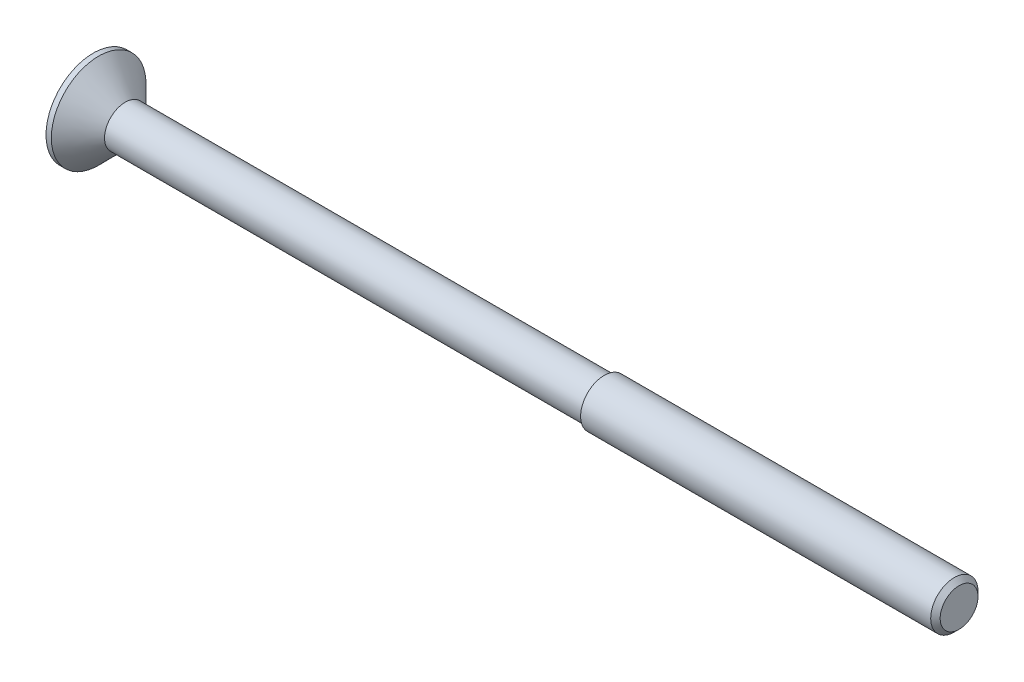
ISO-10303-21;
HEADER;
FILE_DESCRIPTION(('STEP AP214'),'2;1');
FILE_NAME('part.step','',(''),(''),'','','');
FILE_SCHEMA(('AUTOMOTIVE_DESIGN { 1 0 10303 214 1 1 1 1 }'));
ENDSEC;
DATA;
#1=APPLICATION_CONTEXT('core data for automotive mechanical design processes');
#2=APPLICATION_PROTOCOL_DEFINITION('international standard','automotive_design',2000,#1);
#3=PRODUCT_CONTEXT('',#1,'mechanical');
#4=PRODUCT('Part','Part','',(#3));
#5=PRODUCT_RELATED_PRODUCT_CATEGORY('part','',(#4));
#6=PRODUCT_DEFINITION_FORMATION('','',#4);
#7=PRODUCT_DEFINITION_CONTEXT('part definition',#1,'design');
#8=PRODUCT_DEFINITION('design','',#6,#7);
#9=PRODUCT_DEFINITION_SHAPE('','',#8);
#10=(LENGTH_UNIT() NAMED_UNIT(*) SI_UNIT(.MILLI.,.METRE.));
#11=(NAMED_UNIT(*) PLANE_ANGLE_UNIT() SI_UNIT($,.RADIAN.));
#12=(NAMED_UNIT(*) SI_UNIT($,.STERADIAN.) SOLID_ANGLE_UNIT());
#13=UNCERTAINTY_MEASURE_WITH_UNIT(LENGTH_MEASURE(1.E-05),#10,'distance_accuracy_value','');
#14=(GEOMETRIC_REPRESENTATION_CONTEXT(3) GLOBAL_UNCERTAINTY_ASSIGNED_CONTEXT((#13)) GLOBAL_UNIT_ASSIGNED_CONTEXT((#10,
#11,#12)) REPRESENTATION_CONTEXT('',''));
#15=CARTESIAN_POINT('',(0.,0.,0.));
#16=DIRECTION('',(0.,0.,1.));
#17=DIRECTION('',(1.,0.,0.));
#18=AXIS2_PLACEMENT_3D('',#15,#16,#17);
#19=CARTESIAN_POINT('',(0.,0.,0.));
#20=DIRECTION('',(1.,0.,0.));
#21=DIRECTION('',(0.,0.,-1.));
#22=AXIS2_PLACEMENT_3D('',#19,#20,#21);
#23=PLANE('',#22);
#24=CARTESIAN_POINT('',(0.,0.,0.));
#25=DIRECTION('',(-1.,0.,0.));
#26=DIRECTION('',(0.,0.,1.));
#27=AXIS2_PLACEMENT_3D('',#24,#25,#26);
#28=CIRCLE('',#27,4.);
#29=CARTESIAN_POINT('',(0.,0.,4.));
#30=VERTEX_POINT('',#29);
#31=EDGE_CURVE('E106',#30,#30,#28,.T.);
#32=ORIENTED_EDGE('',*,*,#31,.T.);
#33=EDGE_LOOP('',(#32));
#34=FACE_BOUND('',#33,.T.);
#35=DIRECTION('',(0.,0.,1.));
#36=VECTOR('',#35,1.);
#37=CARTESIAN_POINT('',(0.,0.7,0.));
#38=LINE('',#37,#36);
#39=CARTESIAN_POINT('',(0.,0.699999999999991,-2.5));
#40=VERTEX_POINT('',#39);
#41=CARTESIAN_POINT('',(0.,0.699999999999996,-1.0356157588604));
#42=VERTEX_POINT('',#41);
#43=EDGE_CURVE('E245',#40,#42,#38,.T.);
#44=ORIENTED_EDGE('',*,*,#43,.T.);
#45=CARTESIAN_POINT('',(0.,0.,0.));
#46=DIRECTION('',(-1.,0.,0.));
#47=DIRECTION('',(0.,0.,1.));
#48=AXIS2_PLACEMENT_3D('',#45,#46,#47);
#49=CIRCLE('',#48,1.25);
#50=CARTESIAN_POINT('',(0.,1.0356157588604,-0.7));
#51=VERTEX_POINT('',#50);
#52=EDGE_CURVE('E225',#51,#42,#49,.T.);
#53=ORIENTED_EDGE('',*,*,#52,.F.);
#54=DIRECTION('',(0.,-1.,0.));
#55=VECTOR('',#54,1.);
#56=CARTESIAN_POINT('',(0.,0.,-0.7));
#57=LINE('',#56,#55);
#58=CARTESIAN_POINT('',(0.,2.5,-0.7));
#59=VERTEX_POINT('',#58);
#60=EDGE_CURVE('E93',#59,#51,#57,.T.);
#61=ORIENTED_EDGE('',*,*,#60,.F.);
#62=DIRECTION('',(0.,0.,1.));
#63=VECTOR('',#62,1.);
#64=CARTESIAN_POINT('',(0.,2.5,-0.7));
#65=LINE('',#64,#63);
#66=CARTESIAN_POINT('',(0.,2.5,0.7));
#67=VERTEX_POINT('',#66);
#68=EDGE_CURVE('E57',#59,#67,#65,.T.);
#69=ORIENTED_EDGE('',*,*,#68,.T.);
#70=DIRECTION('',(0.,-1.,0.));
#71=VECTOR('',#70,1.);
#72=CARTESIAN_POINT('',(0.,0.,0.7));
#73=LINE('',#72,#71);
#74=CARTESIAN_POINT('',(0.,1.0356157588604,0.7));
#75=VERTEX_POINT('',#74);
#76=EDGE_CURVE('E76',#67,#75,#73,.T.);
#77=ORIENTED_EDGE('',*,*,#76,.T.);
#78=CARTESIAN_POINT('',(0.,0.700000000000004,1.0356157588604));
#79=VERTEX_POINT('',#78);
#80=EDGE_CURVE('E237',#79,#75,#49,.T.);
#81=ORIENTED_EDGE('',*,*,#80,.F.);
#82=CARTESIAN_POINT('',(0.,0.700000000000026,2.49999999999999));
#83=VERTEX_POINT('',#82);
#84=EDGE_CURVE('E256',#79,#83,#38,.T.);
#85=ORIENTED_EDGE('',*,*,#84,.T.);
#86=DIRECTION('',(0.,-1.,0.));
#87=VECTOR('',#86,1.);
#88=CARTESIAN_POINT('',(0.,0.700000000000026,2.49999999999999));
#89=LINE('',#88,#87);
#90=CARTESIAN_POINT('',(0.,-0.699999999999974,2.50000000000001));
#91=VERTEX_POINT('',#90);
#92=EDGE_CURVE('E334',#83,#91,#89,.T.);
#93=ORIENTED_EDGE('',*,*,#92,.T.);
#94=DIRECTION('',(0.,0.,-1.));
#95=VECTOR('',#94,1.);
#96=CARTESIAN_POINT('',(0.,-0.7,0.));
#97=LINE('',#96,#95);
#98=CARTESIAN_POINT('',(0.,-0.699999999999989,1.03561575886041));
#99=VERTEX_POINT('',#98);
#100=EDGE_CURVE('E347',#91,#99,#97,.T.);
#101=ORIENTED_EDGE('',*,*,#100,.T.);
#102=CARTESIAN_POINT('',(0.,-1.0356157588604,0.7));
#103=VERTEX_POINT('',#102);
#104=EDGE_CURVE('E48',#103,#99,#49,.T.);
#105=ORIENTED_EDGE('',*,*,#104,.F.);
#106=DIRECTION('',(0.,1.,0.));
#107=VECTOR('',#106,1.);
#108=CARTESIAN_POINT('',(0.,0.,0.7));
#109=LINE('',#108,#107);
#110=CARTESIAN_POINT('',(0.,-2.5,0.7));
#111=VERTEX_POINT('',#110);
#112=EDGE_CURVE('E324',#111,#103,#109,.T.);
#113=ORIENTED_EDGE('',*,*,#112,.F.);
#114=DIRECTION('',(0.,0.,-1.));
#115=VECTOR('',#114,1.);
#116=CARTESIAN_POINT('',(0.,-2.5,0.7));
#117=LINE('',#116,#115);
#118=CARTESIAN_POINT('',(0.,-2.5,-0.7));
#119=VERTEX_POINT('',#118);
#120=EDGE_CURVE('E315',#111,#119,#117,.T.);
#121=ORIENTED_EDGE('',*,*,#120,.T.);
#122=DIRECTION('',(0.,1.,0.));
#123=VECTOR('',#122,1.);
#124=CARTESIAN_POINT('',(0.,0.,-0.7));
#125=LINE('',#124,#123);
#126=CARTESIAN_POINT('',(0.,-1.0356157588604,-0.7));
#127=VERTEX_POINT('',#126);
#128=EDGE_CURVE('E326',#119,#127,#125,.T.);
#129=ORIENTED_EDGE('',*,*,#128,.T.);
#130=CARTESIAN_POINT('',(0.,-0.700000000000004,-1.0356157588604));
#131=VERTEX_POINT('',#130);
#132=EDGE_CURVE('E238',#131,#127,#49,.T.);
#133=ORIENTED_EDGE('',*,*,#132,.F.);
#134=DIRECTION('',(0.,0.,1.));
#135=VECTOR('',#134,1.);
#136=CARTESIAN_POINT('',(0.,-0.7,0.));
#137=LINE('',#136,#135);
#138=CARTESIAN_POINT('',(0.,-0.700000000000009,-2.5));
#139=VERTEX_POINT('',#138);
#140=EDGE_CURVE('E270',#139,#131,#137,.T.);
#141=ORIENTED_EDGE('',*,*,#140,.F.);
#142=DIRECTION('',(0.,1.,0.));
#143=VECTOR('',#142,1.);
#144=CARTESIAN_POINT('',(0.,-0.700000000000009,-2.5));
#145=LINE('',#144,#143);
#146=EDGE_CURVE('E254',#139,#40,#145,.T.);
#147=ORIENTED_EDGE('',*,*,#146,.T.);
#148=EDGE_LOOP('',(#44,#53,#61,#69,#77,#81,#85,#93,#101,#105,#113,#121,#129,#133,#141,#147));
#149=FACE_BOUND('',#148,.T.);
#150=ADVANCED_FACE('F34',(#34,#149),#23,.F.);
#151=CARTESIAN_POINT('',(0.,0.,-0.7));
#152=DIRECTION('',(0.,0.,-1.));
#153=DIRECTION('',(-1.,0.,0.));
#154=AXIS2_PLACEMENT_3D('',#151,#152,#153);
#155=PLANE('',#154);
#156=ORIENTED_EDGE('',*,*,#60,.T.);
#157=DIRECTION('',(-1.,0.,0.));
#158=VECTOR('',#157,1.);
#159=CARTESIAN_POINT('',(6.03553390593274,1.0356157588604,-0.7));
#160=LINE('',#159,#158);
#161=CARTESIAN_POINT('',(2.43425554726086,1.0356157588604,-0.7));
#162=VERTEX_POINT('',#161);
#163=EDGE_CURVE('E234',#51,#162,#160,.F.);
#164=ORIENTED_EDGE('',*,*,#163,.T.);
#165=DIRECTION('',(-0.894934361602025,0.44619781310981,0.));
#166=VECTOR('',#165,1.);
#167=CARTESIAN_POINT('',(0.5,1.99999999999999,-0.7));
#168=LINE('',#167,#166);
#169=CARTESIAN_POINT('',(0.5,1.99999999999999,-0.7));
#170=VERTEX_POINT('',#169);
#171=EDGE_CURVE('E87',#162,#170,#168,.T.);
#172=ORIENTED_EDGE('',*,*,#171,.T.);
#173=DIRECTION('',(-0.707106781186544,0.707106781186551,0.));
#174=VECTOR('',#173,1.);
#175=CARTESIAN_POINT('',(0.,2.5,-0.7));
#176=LINE('',#175,#174);
#177=EDGE_CURVE('E272',#170,#59,#176,.T.);
#178=ORIENTED_EDGE('',*,*,#177,.T.);
#179=EDGE_LOOP('',(#156,#164,#172,#178));
#180=FACE_BOUND('',#179,.T.);
#181=ADVANCED_FACE('F141',(#180),#155,.F.);
#182=CARTESIAN_POINT('',(0.,0.,0.7));
#183=DIRECTION('',(0.,0.,-1.));
#184=DIRECTION('',(-1.,0.,0.));
#185=AXIS2_PLACEMENT_3D('',#182,#183,#184);
#186=PLANE('',#185);
#187=DIRECTION('',(-1.,0.,0.));
#188=VECTOR('',#187,1.);
#189=CARTESIAN_POINT('',(6.03553390593274,1.0356157588604,0.7));
#190=LINE('',#189,#188);
#191=CARTESIAN_POINT('',(2.43425554726086,1.0356157588604,0.7));
#192=VERTEX_POINT('',#191);
#193=EDGE_CURVE('E84',#75,#192,#190,.F.);
#194=ORIENTED_EDGE('',*,*,#193,.F.);
#195=ORIENTED_EDGE('',*,*,#76,.F.);
#196=DIRECTION('',(-0.707106781186544,0.707106781186551,0.));
#197=VECTOR('',#196,1.);
#198=CARTESIAN_POINT('',(0.,2.5,0.7));
#199=LINE('',#198,#197);
#200=CARTESIAN_POINT('',(0.5,1.99999999999999,0.7));
#201=VERTEX_POINT('',#200);
#202=EDGE_CURVE('E69',#201,#67,#199,.T.);
#203=ORIENTED_EDGE('',*,*,#202,.F.);
#204=DIRECTION('',(-0.894934361602025,0.44619781310981,0.));
#205=VECTOR('',#204,1.);
#206=CARTESIAN_POINT('',(0.5,1.99999999999999,0.7));
#207=LINE('',#206,#205);
#208=EDGE_CURVE('E77',#192,#201,#207,.T.);
#209=ORIENTED_EDGE('',*,*,#208,.F.);
#210=EDGE_LOOP('',(#194,#195,#203,#209));
#211=FACE_BOUND('',#210,.T.);
#212=ADVANCED_FACE('F81',(#211),#186,.T.);
#213=CARTESIAN_POINT('',(43.2,1.75,0.));
#214=DIRECTION('',(1.,0.,0.));
#215=DIRECTION('',(0.,0.,-1.));
#216=AXIS2_PLACEMENT_3D('',#213,#214,#215);
#217=PLANE('',#216);
#218=CARTESIAN_POINT('',(43.2,0.,0.));
#219=DIRECTION('',(-1.,0.,0.));
#220=DIRECTION('',(0.,0.,1.));
#221=AXIS2_PLACEMENT_3D('',#218,#219,#220);
#222=CIRCLE('',#221,1.75);
#223=CARTESIAN_POINT('',(43.2,0.,1.75));
#224=VERTEX_POINT('',#223);
#225=EDGE_CURVE('E94',#224,#224,#222,.T.);
#226=ORIENTED_EDGE('',*,*,#225,.F.);
#227=EDGE_LOOP('',(#226));
#228=FACE_BOUND('',#227,.T.);
#229=CARTESIAN_POINT('',(43.2,0.,0.));
#230=DIRECTION('',(-1.,0.,0.));
#231=DIRECTION('',(0.,0.,1.));
#232=AXIS2_PLACEMENT_3D('',#229,#230,#231);
#233=CIRCLE('',#232,2.);
#234=CARTESIAN_POINT('',(43.2,0.,2.));
#235=VERTEX_POINT('',#234);
#236=EDGE_CURVE('E42',#235,#235,#233,.T.);
#237=ORIENTED_EDGE('',*,*,#236,.T.);
#238=EDGE_LOOP('',(#237));
#239=FACE_BOUND('',#238,.T.);
#240=ADVANCED_FACE('F36',(#228,#239),#217,.F.);
#241=CARTESIAN_POINT('',(0.,0.,0.));
#242=DIRECTION('',(-1.,0.,0.));
#243=DIRECTION('',(0.,0.,1.));
#244=AXIS2_PLACEMENT_3D('',#241,#242,#243);
#245=CYLINDRICAL_SURFACE('',#244,2.);
#246=ORIENTED_EDGE('',*,*,#236,.F.);
#247=EDGE_LOOP('',(#246));
#248=FACE_BOUND('',#247,.T.);
#249=CARTESIAN_POINT('',(72.8,0.,0.));
#250=DIRECTION('',(-1.,0.,0.));
#251=DIRECTION('',(0.,0.,1.));
#252=AXIS2_PLACEMENT_3D('',#249,#250,#251);
#253=CIRCLE('',#252,2.);
#254=CARTESIAN_POINT('',(72.8,0.,2.));
#255=VERTEX_POINT('',#254);
#256=EDGE_CURVE('E112',#255,#255,#253,.T.);
#257=ORIENTED_EDGE('',*,*,#256,.T.);
#258=EDGE_LOOP('',(#257));
#259=FACE_BOUND('',#258,.T.);
#260=ADVANCED_FACE('F118',(#248,#259),#245,.T.);
#261=CARTESIAN_POINT('',(73.2,0.,0.));
#262=DIRECTION('',(-1.,0.,0.));
#263=DIRECTION('',(0.,0.,1.));
#264=AXIS2_PLACEMENT_3D('',#261,#262,#263);
#265=CONICAL_SURFACE('',#264,1.6,0.78539816339745);
#266=ORIENTED_EDGE('',*,*,#256,.F.);
#267=EDGE_LOOP('',(#266));
#268=FACE_BOUND('',#267,.T.);
#269=CARTESIAN_POINT('',(73.2,0.,0.));
#270=DIRECTION('',(-1.,0.,0.));
#271=DIRECTION('',(0.,0.,1.));
#272=AXIS2_PLACEMENT_3D('',#269,#270,#271);
#273=CIRCLE('',#272,1.6);
#274=CARTESIAN_POINT('',(73.2,0.,1.6));
#275=VERTEX_POINT('',#274);
#276=EDGE_CURVE('E109',#275,#275,#273,.T.);
#277=ORIENTED_EDGE('',*,*,#276,.T.);
#278=EDGE_LOOP('',(#277));
#279=FACE_BOUND('',#278,.T.);
#280=ADVANCED_FACE('F121',(#268,#279),#265,.T.);
#281=CARTESIAN_POINT('',(73.2,1.6,0.));
#282=DIRECTION('',(-1.,0.,0.));
#283=DIRECTION('',(0.,0.,1.));
#284=AXIS2_PLACEMENT_3D('',#281,#282,#283);
#285=PLANE('',#284);
#286=ORIENTED_EDGE('',*,*,#276,.F.);
#287=EDGE_LOOP('',(#286));
#288=FACE_BOUND('',#287,.T.);
#289=ADVANCED_FACE('F126',(#288),#285,.F.);
#290=CARTESIAN_POINT('',(0.,0.,0.));
#291=DIRECTION('',(-1.,0.,0.));
#292=DIRECTION('',(0.,0.,1.));
#293=AXIS2_PLACEMENT_3D('',#290,#291,#292);
#294=CYLINDRICAL_SURFACE('',#293,4.);
#295=ORIENTED_EDGE('',*,*,#31,.F.);
#296=EDGE_LOOP('',(#295));
#297=FACE_BOUND('',#296,.T.);
#298=CARTESIAN_POINT('',(0.450000000000007,0.,0.));
#299=DIRECTION('',(-1.,0.,0.));
#300=DIRECTION('',(0.,0.,1.));
#301=AXIS2_PLACEMENT_3D('',#298,#299,#300);
#302=CIRCLE('',#301,4.);
#303=CARTESIAN_POINT('',(0.450000000000007,0.,4.));
#304=VERTEX_POINT('',#303);
#305=EDGE_CURVE('E103',#304,#304,#302,.T.);
#306=ORIENTED_EDGE('',*,*,#305,.T.);
#307=EDGE_LOOP('',(#306));
#308=FACE_BOUND('',#307,.T.);
#309=ADVANCED_FACE('F131',(#297,#308),#294,.T.);
#310=CARTESIAN_POINT('',(2.7,0.,0.));
#311=DIRECTION('',(-1.,0.,0.));
#312=DIRECTION('',(0.,0.,1.));
#313=AXIS2_PLACEMENT_3D('',#310,#311,#312);
#314=CONICAL_SURFACE('',#313,1.75,0.78539816339745);
#315=ORIENTED_EDGE('',*,*,#305,.F.);
#316=EDGE_LOOP('',(#315));
#317=FACE_BOUND('',#316,.T.);
#318=CARTESIAN_POINT('',(2.7,0.,0.));
#319=DIRECTION('',(-1.,0.,0.));
#320=DIRECTION('',(0.,0.,1.));
#321=AXIS2_PLACEMENT_3D('',#318,#319,#320);
#322=CIRCLE('',#321,1.75);
#323=CARTESIAN_POINT('',(2.7,0.,1.75));
#324=VERTEX_POINT('',#323);
#325=EDGE_CURVE('E97',#324,#324,#322,.T.);
#326=ORIENTED_EDGE('',*,*,#325,.T.);
#327=EDGE_LOOP('',(#326));
#328=FACE_BOUND('',#327,.T.);
#329=ADVANCED_FACE('F136',(#317,#328),#314,.T.);
#330=CARTESIAN_POINT('',(0.,0.,0.));
#331=DIRECTION('',(-1.,0.,0.));
#332=DIRECTION('',(0.,0.,1.));
#333=AXIS2_PLACEMENT_3D('',#330,#331,#332);
#334=CYLINDRICAL_SURFACE('',#333,1.75);
#335=ORIENTED_EDGE('',*,*,#325,.F.);
#336=EDGE_LOOP('',(#335));
#337=FACE_BOUND('',#336,.T.);
#338=ORIENTED_EDGE('',*,*,#225,.T.);
#339=EDGE_LOOP('',(#338));
#340=FACE_BOUND('',#339,.T.);
#341=ADVANCED_FACE('F151',(#337,#340),#334,.T.);
#342=CARTESIAN_POINT('',(0.,2.5,-0.7));
#343=DIRECTION('',(0.707106781186551,0.707106781186544,0.));
#344=DIRECTION('',(-0.707106781186544,0.707106781186551,0.));
#345=AXIS2_PLACEMENT_3D('',#342,#343,#344);
#346=PLANE('',#345);
#347=ORIENTED_EDGE('',*,*,#202,.T.);
#348=ORIENTED_EDGE('',*,*,#68,.F.);
#349=ORIENTED_EDGE('',*,*,#177,.F.);
#350=DIRECTION('',(0.,0.,1.));
#351=VECTOR('',#350,1.);
#352=CARTESIAN_POINT('',(0.5,1.99999999999999,-0.7));
#353=LINE('',#352,#351);
#354=EDGE_CURVE('E73',#170,#201,#353,.T.);
#355=ORIENTED_EDGE('',*,*,#354,.T.);
#356=EDGE_LOOP('',(#347,#348,#349,#355));
#357=FACE_BOUND('',#356,.T.);
#358=ADVANCED_FACE('F71',(#357),#346,.F.);
#359=CARTESIAN_POINT('',(0.5,1.99999999999999,-0.7));
#360=DIRECTION('',(0.44619781310981,0.894934361602025,0.));
#361=DIRECTION('',(-0.894934361602025,0.44619781310981,0.));
#362=AXIS2_PLACEMENT_3D('',#359,#360,#361);
#363=PLANE('',#362);
#364=ORIENTED_EDGE('',*,*,#171,.F.);
#365=CARTESIAN_POINT('',(4.51137941651802,0.,0.));
#366=DIRECTION('',(0.44619781310981,0.894934361602025,0.));
#367=DIRECTION('',(-0.894934361602025,0.44619781310981,0.));
#368=AXIS2_PLACEMENT_3D('',#365,#366,#367);
#369=ELLIPSE('',#368,2.80144806467793,1.25);
#370=EDGE_CURVE('E249',#162,#192,#369,.T.);
#371=ORIENTED_EDGE('',*,*,#370,.T.);
#372=ORIENTED_EDGE('',*,*,#208,.T.);
#373=ORIENTED_EDGE('',*,*,#354,.F.);
#374=EDGE_LOOP('',(#364,#371,#372,#373));
#375=FACE_BOUND('',#374,.T.);
#376=ADVANCED_FACE('F161',(#375),#363,.F.);
#377=CARTESIAN_POINT('',(0.,0.7,0.));
#378=DIRECTION('',(0.,-1.,0.));
#379=DIRECTION('',(-1.,0.,0.));
#380=AXIS2_PLACEMENT_3D('',#377,#378,#379);
#381=PLANE('',#380);
#382=DIRECTION('',(-1.,0.,0.));
#383=VECTOR('',#382,1.);
#384=CARTESIAN_POINT('',(6.03553390593274,0.699999999999996,-1.0356157588604));
#385=LINE('',#384,#383);
#386=CARTESIAN_POINT('',(2.43425554726086,0.699999999999996,-1.0356157588604));
#387=VERTEX_POINT('',#386);
#388=EDGE_CURVE('E229',#42,#387,#385,.F.);
#389=ORIENTED_EDGE('',*,*,#388,.F.);
#390=ORIENTED_EDGE('',*,*,#43,.F.);
#391=DIRECTION('',(-0.707106781186544,0.,-0.707106781186551));
#392=VECTOR('',#391,1.);
#393=CARTESIAN_POINT('',(0.,0.699999999999991,-2.5));
#394=LINE('',#393,#392);
#395=CARTESIAN_POINT('',(0.5,0.699999999999993,-2.));
#396=VERTEX_POINT('',#395);
#397=EDGE_CURVE('E262',#396,#40,#394,.T.);
#398=ORIENTED_EDGE('',*,*,#397,.F.);
#399=DIRECTION('',(-0.894934361602025,0.,-0.44619781310981));
#400=VECTOR('',#399,1.);
#401=CARTESIAN_POINT('',(0.5,0.699999999999993,-2.));
#402=LINE('',#401,#400);
#403=EDGE_CURVE('E248',#387,#396,#402,.T.);
#404=ORIENTED_EDGE('',*,*,#403,.F.);
#405=EDGE_LOOP('',(#389,#390,#398,#404));
#406=FACE_BOUND('',#405,.T.);
#407=ADVANCED_FACE('F164',(#406),#381,.T.);
#408=CARTESIAN_POINT('',(0.,-0.7,0.));
#409=DIRECTION('',(0.,-1.,0.));
#410=DIRECTION('',(-1.,0.,0.));
#411=AXIS2_PLACEMENT_3D('',#408,#409,#410);
#412=PLANE('',#411);
#413=ORIENTED_EDGE('',*,*,#140,.T.);
#414=DIRECTION('',(-1.,0.,0.));
#415=VECTOR('',#414,1.);
#416=CARTESIAN_POINT('',(6.03553390593274,-0.700000000000004,-1.0356157588604));
#417=LINE('',#416,#415);
#418=CARTESIAN_POINT('',(2.43425554726087,-0.700000000000004,-1.0356157588604));
#419=VERTEX_POINT('',#418);
#420=EDGE_CURVE('E250',#131,#419,#417,.F.);
#421=ORIENTED_EDGE('',*,*,#420,.T.);
#422=DIRECTION('',(-0.894934361602025,0.,-0.44619781310981));
#423=VECTOR('',#422,1.);
#424=CARTESIAN_POINT('',(0.5,-0.700000000000007,-1.99999999999999));
#425=LINE('',#424,#423);
#426=CARTESIAN_POINT('',(0.5,-0.700000000000007,-1.99999999999999));
#427=VERTEX_POINT('',#426);
#428=EDGE_CURVE('E255',#419,#427,#425,.T.);
#429=ORIENTED_EDGE('',*,*,#428,.T.);
#430=DIRECTION('',(-0.707106781186544,0.,-0.707106781186551));
#431=VECTOR('',#430,1.);
#432=CARTESIAN_POINT('',(0.,-0.700000000000009,-2.5));
#433=LINE('',#432,#431);
#434=EDGE_CURVE('E259',#427,#139,#433,.T.);
#435=ORIENTED_EDGE('',*,*,#434,.T.);
#436=EDGE_LOOP('',(#413,#421,#429,#435));
#437=FACE_BOUND('',#436,.T.);
#438=ADVANCED_FACE('F178',(#437),#412,.F.);
#439=CARTESIAN_POINT('',(0.,-0.700000000000009,-2.5));
#440=DIRECTION('',(0.707106781186551,0.,-0.707106781186544));
#441=DIRECTION('',(-0.707106781186544,0.,-0.707106781186551));
#442=AXIS2_PLACEMENT_3D('',#439,#440,#441);
#443=PLANE('',#442);
#444=ORIENTED_EDGE('',*,*,#397,.T.);
#445=ORIENTED_EDGE('',*,*,#146,.F.);
#446=ORIENTED_EDGE('',*,*,#434,.F.);
#447=DIRECTION('',(0.,1.,0.));
#448=VECTOR('',#447,1.);
#449=CARTESIAN_POINT('',(0.5,-0.700000000000007,-1.99999999999999));
#450=LINE('',#449,#448);
#451=EDGE_CURVE('E267',#427,#396,#450,.T.);
#452=ORIENTED_EDGE('',*,*,#451,.T.);
#453=EDGE_LOOP('',(#444,#445,#446,#452));
#454=FACE_BOUND('',#453,.T.);
#455=ADVANCED_FACE('F174',(#454),#443,.F.);
#456=CARTESIAN_POINT('',(0.5,-0.700000000000007,-1.99999999999999));
#457=DIRECTION('',(0.44619781310981,0.,-0.894934361602025));
#458=DIRECTION('',(-0.894934361602025,0.,-0.44619781310981));
#459=AXIS2_PLACEMENT_3D('',#456,#457,#458);
#460=PLANE('',#459);
#461=ORIENTED_EDGE('',*,*,#428,.F.);
#462=CARTESIAN_POINT('',(4.51137941651802,0.,0.));
#463=DIRECTION('',(0.44619781310981,0.,-0.894934361602025));
#464=DIRECTION('',(-0.894934361602025,0.,-0.44619781310981));
#465=AXIS2_PLACEMENT_3D('',#462,#463,#464);
#466=ELLIPSE('',#465,2.80144806467793,1.25);
#467=EDGE_CURVE('E363',#419,#387,#466,.T.);
#468=ORIENTED_EDGE('',*,*,#467,.T.);
#469=ORIENTED_EDGE('',*,*,#403,.T.);
#470=ORIENTED_EDGE('',*,*,#451,.F.);
#471=EDGE_LOOP('',(#461,#468,#469,#470));
#472=FACE_BOUND('',#471,.T.);
#473=ADVANCED_FACE('F170',(#472),#460,.F.);
#474=DIRECTION('',(-1.,0.,0.));
#475=VECTOR('',#474,1.);
#476=CARTESIAN_POINT('',(6.03553390593274,0.700000000000004,1.0356157588604));
#477=LINE('',#476,#475);
#478=CARTESIAN_POINT('',(2.43425554726086,0.700000000000011,1.03561575886039));
#479=VERTEX_POINT('',#478);
#480=EDGE_CURVE('E374',#479,#79,#477,.T.);
#481=ORIENTED_EDGE('',*,*,#480,.F.);
#482=DIRECTION('',(-0.894934361602025,0.,0.44619781310981));
#483=VECTOR('',#482,1.);
#484=CARTESIAN_POINT('',(0.5,0.700000000000021,1.99999999999999));
#485=LINE('',#484,#483);
#486=CARTESIAN_POINT('',(0.5,0.700000000000021,1.99999999999999));
#487=VERTEX_POINT('',#486);
#488=EDGE_CURVE('E350',#479,#487,#485,.T.);
#489=ORIENTED_EDGE('',*,*,#488,.T.);
#490=DIRECTION('',(-0.707106781186544,0.,0.707106781186551));
#491=VECTOR('',#490,1.);
#492=CARTESIAN_POINT('',(0.,0.700000000000026,2.49999999999999));
#493=LINE('',#492,#491);
#494=EDGE_CURVE('E344',#487,#83,#493,.T.);
#495=ORIENTED_EDGE('',*,*,#494,.T.);
#496=ORIENTED_EDGE('',*,*,#84,.F.);
#497=EDGE_LOOP('',(#481,#489,#495,#496));
#498=FACE_BOUND('',#497,.T.);
#499=ADVANCED_FACE('F173',(#498),#381,.T.);
#500=CARTESIAN_POINT('',(0.,0.,0.7));
#501=DIRECTION('',(0.,0.,1.));
#502=DIRECTION('',(-1.,0.,0.));
#503=AXIS2_PLACEMENT_3D('',#500,#501,#502);
#504=PLANE('',#503);
#505=ORIENTED_EDGE('',*,*,#112,.T.);
#506=DIRECTION('',(-1.,0.,0.));
#507=VECTOR('',#506,1.);
#508=CARTESIAN_POINT('',(6.03553390593274,-1.0356157588604,0.7));
#509=LINE('',#508,#507);
#510=CARTESIAN_POINT('',(2.43425554726086,-1.0356157588604,0.7));
#511=VERTEX_POINT('',#510);
#512=EDGE_CURVE('E365',#103,#511,#509,.F.);
#513=ORIENTED_EDGE('',*,*,#512,.T.);
#514=DIRECTION('',(-0.894934361602025,-0.44619781310981,0.));
#515=VECTOR('',#514,1.);
#516=CARTESIAN_POINT('',(0.5,-1.99999999999999,0.7));
#517=LINE('',#516,#515);
#518=CARTESIAN_POINT('',(0.5,-1.99999999999999,0.7));
#519=VERTEX_POINT('',#518);
#520=EDGE_CURVE('E329',#511,#519,#517,.T.);
#521=ORIENTED_EDGE('',*,*,#520,.T.);
#522=DIRECTION('',(-0.707106781186544,-0.707106781186551,0.));
#523=VECTOR('',#522,1.);
#524=CARTESIAN_POINT('',(0.,-2.5,0.7));
#525=LINE('',#524,#523);
#526=EDGE_CURVE('E337',#519,#111,#525,.T.);
#527=ORIENTED_EDGE('',*,*,#526,.T.);
#528=EDGE_LOOP('',(#505,#513,#521,#527));
#529=FACE_BOUND('',#528,.T.);
#530=ADVANCED_FACE('F182',(#529),#504,.F.);
#531=CARTESIAN_POINT('',(0.,-2.5,0.7));
#532=DIRECTION('',(0.707106781186551,-0.707106781186544,0.));
#533=DIRECTION('',(0.707106781186544,0.707106781186551,0.));
#534=AXIS2_PLACEMENT_3D('',#531,#532,#533);
#535=PLANE('',#534);
#536=DIRECTION('',(-0.707106781186544,-0.707106781186551,0.));
#537=VECTOR('',#536,1.);
#538=CARTESIAN_POINT('',(0.,-2.5,-0.7));
#539=LINE('',#538,#537);
#540=CARTESIAN_POINT('',(0.5,-1.99999999999999,-0.7));
#541=VERTEX_POINT('',#540);
#542=EDGE_CURVE('E330',#541,#119,#539,.T.);
#543=ORIENTED_EDGE('',*,*,#542,.T.);
#544=ORIENTED_EDGE('',*,*,#120,.F.);
#545=ORIENTED_EDGE('',*,*,#526,.F.);
#546=DIRECTION('',(0.,0.,-1.));
#547=VECTOR('',#546,1.);
#548=CARTESIAN_POINT('',(0.5,-1.99999999999999,0.7));
#549=LINE('',#548,#547);
#550=EDGE_CURVE('E317',#519,#541,#549,.T.);
#551=ORIENTED_EDGE('',*,*,#550,.T.);
#552=EDGE_LOOP('',(#543,#544,#545,#551));
#553=FACE_BOUND('',#552,.T.);
#554=ADVANCED_FACE('F191',(#553),#535,.F.);
#555=CARTESIAN_POINT('',(0.5,-1.99999999999999,0.7));
#556=DIRECTION('',(0.44619781310981,-0.894934361602025,0.));
#557=DIRECTION('',(0.894934361602025,0.44619781310981,0.));
#558=AXIS2_PLACEMENT_3D('',#555,#556,#557);
#559=PLANE('',#558);
#560=ORIENTED_EDGE('',*,*,#520,.F.);
#561=CARTESIAN_POINT('',(4.51137941651802,0.,0.));
#562=DIRECTION('',(0.44619781310981,-0.894934361602025,0.));
#563=DIRECTION('',(-0.894934361602025,-0.44619781310981,0.));
#564=AXIS2_PLACEMENT_3D('',#561,#562,#563);
#565=ELLIPSE('',#564,2.80144806467793,1.25);
#566=CARTESIAN_POINT('',(2.43425554726086,-1.0356157588604,-0.7));
#567=VERTEX_POINT('',#566);
#568=EDGE_CURVE('E368',#511,#567,#565,.T.);
#569=ORIENTED_EDGE('',*,*,#568,.T.);
#570=DIRECTION('',(-0.894934361602025,-0.44619781310981,0.));
#571=VECTOR('',#570,1.);
#572=CARTESIAN_POINT('',(0.5,-1.99999999999999,-0.7));
#573=LINE('',#572,#571);
#574=EDGE_CURVE('E332',#567,#541,#573,.T.);
#575=ORIENTED_EDGE('',*,*,#574,.T.);
#576=ORIENTED_EDGE('',*,*,#550,.F.);
#577=EDGE_LOOP('',(#560,#569,#575,#576));
#578=FACE_BOUND('',#577,.T.);
#579=ADVANCED_FACE('F187',(#578),#559,.F.);
#580=CARTESIAN_POINT('',(0.,0.,-0.7));
#581=DIRECTION('',(0.,0.,1.));
#582=DIRECTION('',(-1.,0.,0.));
#583=AXIS2_PLACEMENT_3D('',#580,#581,#582);
#584=PLANE('',#583);
#585=DIRECTION('',(-1.,0.,0.));
#586=VECTOR('',#585,1.);
#587=CARTESIAN_POINT('',(6.03553390593274,-1.0356157588604,-0.7));
#588=LINE('',#587,#586);
#589=EDGE_CURVE('E371',#127,#567,#588,.F.);
#590=ORIENTED_EDGE('',*,*,#589,.F.);
#591=ORIENTED_EDGE('',*,*,#128,.F.);
#592=ORIENTED_EDGE('',*,*,#542,.F.);
#593=ORIENTED_EDGE('',*,*,#574,.F.);
#594=EDGE_LOOP('',(#590,#591,#592,#593));
#595=FACE_BOUND('',#594,.T.);
#596=ADVANCED_FACE('F190',(#595),#584,.T.);
#597=CARTESIAN_POINT('',(0.,0.700000000000026,2.49999999999999));
#598=DIRECTION('',(0.707106781186551,0.,0.707106781186544));
#599=DIRECTION('',(0.707106781186544,0.,-0.707106781186551));
#600=AXIS2_PLACEMENT_3D('',#597,#598,#599);
#601=PLANE('',#600);
#602=DIRECTION('',(-0.707106781186544,0.,0.707106781186551));
#603=VECTOR('',#602,1.);
#604=CARTESIAN_POINT('',(0.,-0.699999999999974,2.50000000000001));
#605=LINE('',#604,#603);
#606=CARTESIAN_POINT('',(0.5,-0.699999999999979,2.));
#607=VERTEX_POINT('',#606);
#608=EDGE_CURVE('E351',#607,#91,#605,.T.);
#609=ORIENTED_EDGE('',*,*,#608,.T.);
#610=ORIENTED_EDGE('',*,*,#92,.F.);
#611=ORIENTED_EDGE('',*,*,#494,.F.);
#612=DIRECTION('',(0.,-1.,0.));
#613=VECTOR('',#612,1.);
#614=CARTESIAN_POINT('',(0.5,0.700000000000021,1.99999999999999));
#615=LINE('',#614,#613);
#616=EDGE_CURVE('E341',#487,#607,#615,.T.);
#617=ORIENTED_EDGE('',*,*,#616,.T.);
#618=EDGE_LOOP('',(#609,#610,#611,#617));
#619=FACE_BOUND('',#618,.T.);
#620=ADVANCED_FACE('F198',(#619),#601,.F.);
#621=CARTESIAN_POINT('',(0.5,0.700000000000021,1.99999999999999));
#622=DIRECTION('',(0.44619781310981,0.,0.894934361602025));
#623=DIRECTION('',(0.894934361602025,0.,-0.44619781310981));
#624=AXIS2_PLACEMENT_3D('',#621,#622,#623);
#625=PLANE('',#624);
#626=ORIENTED_EDGE('',*,*,#488,.F.);
#627=CARTESIAN_POINT('',(4.51137941651802,0.,0.));
#628=DIRECTION('',(0.44619781310981,0.,0.894934361602025));
#629=DIRECTION('',(-0.894934361602025,0.,0.44619781310981));
#630=AXIS2_PLACEMENT_3D('',#627,#628,#629);
#631=ELLIPSE('',#630,2.80144806467793,1.25);
#632=CARTESIAN_POINT('',(2.43425554726086,-0.699999999999989,1.03561575886041));
#633=VERTEX_POINT('',#632);
#634=EDGE_CURVE('E377',#479,#633,#631,.T.);
#635=ORIENTED_EDGE('',*,*,#634,.T.);
#636=DIRECTION('',(-0.894934361602025,0.,0.44619781310981));
#637=VECTOR('',#636,1.);
#638=CARTESIAN_POINT('',(0.5,-0.699999999999979,2.));
#639=LINE('',#638,#637);
#640=EDGE_CURVE('E353',#633,#607,#639,.T.);
#641=ORIENTED_EDGE('',*,*,#640,.T.);
#642=ORIENTED_EDGE('',*,*,#616,.F.);
#643=EDGE_LOOP('',(#626,#635,#641,#642));
#644=FACE_BOUND('',#643,.T.);
#645=ADVANCED_FACE('F203',(#644),#625,.F.);
#646=CARTESIAN_POINT('',(0.,-0.7,0.));
#647=DIRECTION('',(0.,1.,0.));
#648=DIRECTION('',(-1.,0.,0.));
#649=AXIS2_PLACEMENT_3D('',#646,#647,#648);
#650=PLANE('',#649);
#651=DIRECTION('',(-1.,0.,0.));
#652=VECTOR('',#651,1.);
#653=CARTESIAN_POINT('',(6.03553390593274,-0.699999999999989,1.03561575886041));
#654=LINE('',#653,#652);
#655=EDGE_CURVE('E11',#99,#633,#654,.F.);
#656=ORIENTED_EDGE('',*,*,#655,.F.);
#657=ORIENTED_EDGE('',*,*,#100,.F.);
#658=ORIENTED_EDGE('',*,*,#608,.F.);
#659=ORIENTED_EDGE('',*,*,#640,.F.);
#660=EDGE_LOOP('',(#656,#657,#658,#659));
#661=FACE_BOUND('',#660,.T.);
#662=ADVANCED_FACE('F206',(#661),#650,.T.);
#663=CARTESIAN_POINT('',(6.03553390593274,0.,0.));
#664=DIRECTION('',(-1.,0.,0.));
#665=DIRECTION('',(0.,0.,1.));
#666=AXIS2_PLACEMENT_3D('',#663,#664,#665);
#667=CYLINDRICAL_SURFACE('',#666,1.25);
#668=CARTESIAN_POINT('',(2.5,0.,0.));
#669=DIRECTION('',(1.,0.,0.));
#670=DIRECTION('',(0.,0.,-1.));
#671=AXIS2_PLACEMENT_3D('',#668,#669,#670);
#672=CIRCLE('',#671,1.25);
#673=CARTESIAN_POINT('',(2.5,0.,-1.25));
#674=VERTEX_POINT('',#673);
#675=EDGE_CURVE('E220',#674,#674,#672,.F.);
#676=ORIENTED_EDGE('',*,*,#675,.F.);
#677=EDGE_LOOP('',(#676));
#678=FACE_BOUND('',#677,.T.);
#679=ORIENTED_EDGE('',*,*,#52,.T.);
#680=ORIENTED_EDGE('',*,*,#388,.T.);
#681=ORIENTED_EDGE('',*,*,#467,.F.);
#682=ORIENTED_EDGE('',*,*,#420,.F.);
#683=ORIENTED_EDGE('',*,*,#132,.T.);
#684=ORIENTED_EDGE('',*,*,#589,.T.);
#685=ORIENTED_EDGE('',*,*,#568,.F.);
#686=ORIENTED_EDGE('',*,*,#512,.F.);
#687=ORIENTED_EDGE('',*,*,#104,.T.);
#688=ORIENTED_EDGE('',*,*,#655,.T.);
#689=ORIENTED_EDGE('',*,*,#634,.F.);
#690=ORIENTED_EDGE('',*,*,#480,.T.);
#691=ORIENTED_EDGE('',*,*,#80,.T.);
#692=ORIENTED_EDGE('',*,*,#193,.T.);
#693=ORIENTED_EDGE('',*,*,#370,.F.);
#694=ORIENTED_EDGE('',*,*,#163,.F.);
#695=EDGE_LOOP('',(#679,#680,#681,#682,#683,#684,#685,#686,#687,#688,#689,#690,#691,#692,#693,#694));
#696=FACE_BOUND('',#695,.T.);
#697=ADVANCED_FACE('F159',(#678,#696),#667,.F.);
#698=CARTESIAN_POINT('',(2.5,1.00283678389313,-0.7));
#699=DIRECTION('',(1.,0.,0.));
#700=DIRECTION('',(0.,0.,-1.));
#701=AXIS2_PLACEMENT_3D('',#698,#699,#700);
#702=PLANE('',#701);
#703=ORIENTED_EDGE('',*,*,#675,.T.);
#704=EDGE_LOOP('',(#703));
#705=FACE_BOUND('',#704,.T.);
#706=ADVANCED_FACE('F156',(#705),#702,.F.);
#707=CLOSED_SHELL('',(#150,#181,#212,#240,#260,#280,#289,#309,#329,#341,#358,#376,#407,#438,
#455,#473,#499,#530,#554,#579,#596,#620,#645,#662,#697,#706));
#708=MANIFOLD_SOLID_BREP('B2',#707);
#709=ADVANCED_BREP_SHAPE_REPRESENTATION('',(#18,#708),#14);
#710=SHAPE_DEFINITION_REPRESENTATION(#9,#709);
ENDSEC;
END-ISO-10303-21;
